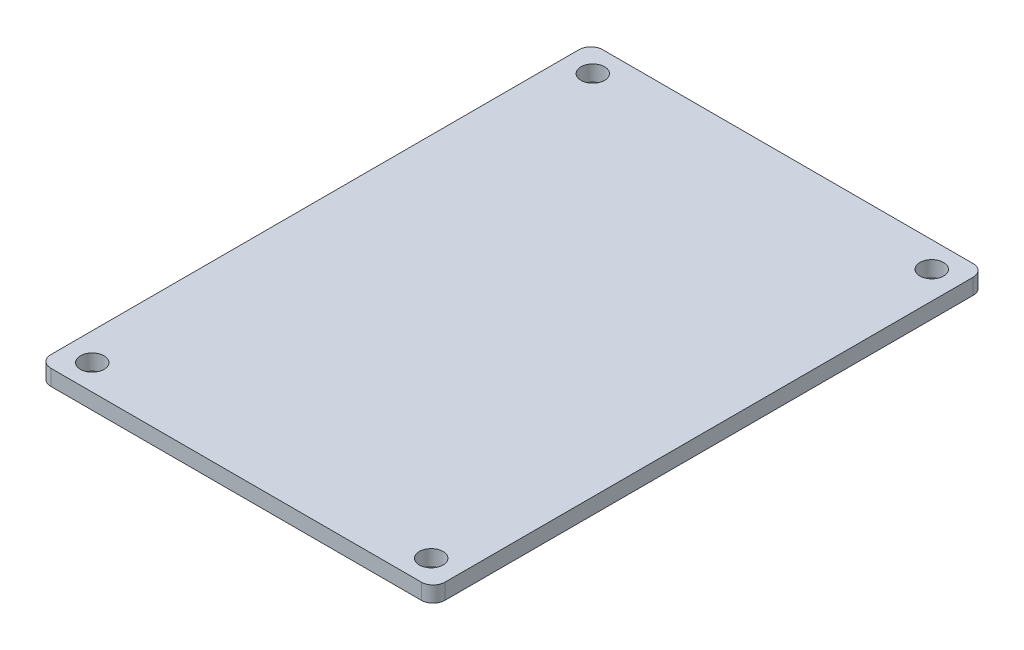
ISO-10303-21;
HEADER;
FILE_DESCRIPTION(('STEP AP214'),'2;1');
FILE_NAME('part.step','',(''),(''),'','','');
FILE_SCHEMA(('AUTOMOTIVE_DESIGN { 1 0 10303 214 1 1 1 1 }'));
ENDSEC;
DATA;
#1=APPLICATION_CONTEXT('core data for automotive mechanical design processes');
#2=APPLICATION_PROTOCOL_DEFINITION('international standard','automotive_design',2000,#1);
#3=PRODUCT_CONTEXT('',#1,'mechanical');
#4=PRODUCT('Part','Part','',(#3));
#5=PRODUCT_RELATED_PRODUCT_CATEGORY('part','',(#4));
#6=PRODUCT_DEFINITION_FORMATION('','',#4);
#7=PRODUCT_DEFINITION_CONTEXT('part definition',#1,'design');
#8=PRODUCT_DEFINITION('design','',#6,#7);
#9=PRODUCT_DEFINITION_SHAPE('','',#8);
#10=(LENGTH_UNIT() NAMED_UNIT(*) SI_UNIT(.MILLI.,.METRE.));
#11=(NAMED_UNIT(*) PLANE_ANGLE_UNIT() SI_UNIT($,.RADIAN.));
#12=(NAMED_UNIT(*) SI_UNIT($,.STERADIAN.) SOLID_ANGLE_UNIT());
#13=UNCERTAINTY_MEASURE_WITH_UNIT(LENGTH_MEASURE(1.E-05),#10,'distance_accuracy_value','');
#14=(GEOMETRIC_REPRESENTATION_CONTEXT(3) GLOBAL_UNCERTAINTY_ASSIGNED_CONTEXT((#13)) GLOBAL_UNIT_ASSIGNED_CONTEXT((#10,
#11,#12)) REPRESENTATION_CONTEXT('',''));
#15=CARTESIAN_POINT('',(0.,0.,0.));
#16=DIRECTION('',(0.,0.,1.));
#17=DIRECTION('',(1.,0.,0.));
#18=AXIS2_PLACEMENT_3D('',#15,#16,#17);
#19=CARTESIAN_POINT('',(-67.2101449275362,4.,-82.8079710144928));
#20=DIRECTION('',(1.,0.,0.));
#21=DIRECTION('',(0.,0.,-1.));
#22=AXIS2_PLACEMENT_3D('',#19,#20,#21);
#23=PLANE('',#22);
#24=DIRECTION('',(0.,0.,1.));
#25=VECTOR('',#24,1.);
#26=CARTESIAN_POINT('',(-67.2101449275362,4.,-82.8079710144928));
#27=LINE('',#26,#25);
#28=CARTESIAN_POINT('',(-67.2101449275362,4.,-79.8079710144928));
#29=VERTEX_POINT('',#28);
#30=CARTESIAN_POINT('',(-67.2101449275362,4.,54.1920289855073));
#31=VERTEX_POINT('',#30);
#32=EDGE_CURVE('E146',#29,#31,#27,.T.);
#33=ORIENTED_EDGE('',*,*,#32,.F.);
#34=DIRECTION('',(0.,-1.,0.));
#35=VECTOR('',#34,1.);
#36=CARTESIAN_POINT('',(-67.2101449275362,4.,-79.8079710144928));
#37=LINE('',#36,#35);
#38=CARTESIAN_POINT('',(-67.2101449275362,0.,-79.8079710144928));
#39=VERTEX_POINT('',#38);
#40=EDGE_CURVE('E11',#29,#39,#37,.T.);
#41=ORIENTED_EDGE('',*,*,#40,.T.);
#42=DIRECTION('',(0.,0.,1.));
#43=VECTOR('',#42,1.);
#44=CARTESIAN_POINT('',(-67.2101449275362,0.,-82.8079710144928));
#45=LINE('',#44,#43);
#46=CARTESIAN_POINT('',(-67.2101449275362,0.,54.1920289855073));
#47=VERTEX_POINT('',#46);
#48=EDGE_CURVE('E148',#39,#47,#45,.T.);
#49=ORIENTED_EDGE('',*,*,#48,.T.);
#50=DIRECTION('',(0.,-1.,0.));
#51=VECTOR('',#50,1.);
#52=CARTESIAN_POINT('',(-67.2101449275362,4.,54.1920289855073));
#53=LINE('',#52,#51);
#54=EDGE_CURVE('E54',#47,#31,#53,.F.);
#55=ORIENTED_EDGE('',*,*,#54,.T.);
#56=EDGE_LOOP('',(#33,#41,#49,#55));
#57=FACE_BOUND('',#56,.T.);
#58=ADVANCED_FACE('F45',(#57),#23,.F.);
#59=CARTESIAN_POINT('',(-67.2101449275362,4.,57.1920289855073));
#60=DIRECTION('',(0.,0.,-1.));
#61=DIRECTION('',(-1.,0.,0.));
#62=AXIS2_PLACEMENT_3D('',#59,#60,#61);
#63=PLANE('',#62);
#64=DIRECTION('',(1.,0.,0.));
#65=VECTOR('',#64,1.);
#66=CARTESIAN_POINT('',(-67.2101449275362,0.,57.1920289855073));
#67=LINE('',#66,#65);
#68=CARTESIAN_POINT('',(-64.2101449275362,0.,57.1920289855073));
#69=VERTEX_POINT('',#68);
#70=CARTESIAN_POINT('',(29.7898550724637,0.,57.1920289855073));
#71=VERTEX_POINT('',#70);
#72=EDGE_CURVE('E142',#69,#71,#67,.T.);
#73=ORIENTED_EDGE('',*,*,#72,.T.);
#74=DIRECTION('',(0.,-1.,0.));
#75=VECTOR('',#74,1.);
#76=CARTESIAN_POINT('',(29.7898550724638,4.,57.1920289855073));
#77=LINE('',#76,#75);
#78=CARTESIAN_POINT('',(29.7898550724637,4.,57.1920289855073));
#79=VERTEX_POINT('',#78);
#80=EDGE_CURVE('E118',#71,#79,#77,.F.);
#81=ORIENTED_EDGE('',*,*,#80,.T.);
#82=DIRECTION('',(1.,0.,0.));
#83=VECTOR('',#82,1.);
#84=CARTESIAN_POINT('',(-67.2101449275362,4.,57.1920289855073));
#85=LINE('',#84,#83);
#86=CARTESIAN_POINT('',(-64.2101449275362,4.,57.1920289855073));
#87=VERTEX_POINT('',#86);
#88=EDGE_CURVE('E198',#87,#79,#85,.T.);
#89=ORIENTED_EDGE('',*,*,#88,.F.);
#90=DIRECTION('',(0.,-1.,0.));
#91=VECTOR('',#90,1.);
#92=CARTESIAN_POINT('',(-64.2101449275362,4.,57.1920289855073));
#93=LINE('',#92,#91);
#94=EDGE_CURVE('E124',#87,#69,#93,.T.);
#95=ORIENTED_EDGE('',*,*,#94,.T.);
#96=EDGE_LOOP('',(#73,#81,#89,#95));
#97=FACE_BOUND('',#96,.T.);
#98=ADVANCED_FACE('F202',(#97),#63,.F.);
#99=CARTESIAN_POINT('',(32.7898550724638,4.,-82.8079710144928));
#100=DIRECTION('',(-1.,0.,0.));
#101=DIRECTION('',(0.,0.,1.));
#102=AXIS2_PLACEMENT_3D('',#99,#100,#101);
#103=PLANE('',#102);
#104=DIRECTION('',(0.,0.,-1.));
#105=VECTOR('',#104,1.);
#106=CARTESIAN_POINT('',(32.7898550724638,4.,-82.8079710144928));
#107=LINE('',#106,#105);
#108=CARTESIAN_POINT('',(32.7898550724638,4.,54.1920289855073));
#109=VERTEX_POINT('',#108);
#110=CARTESIAN_POINT('',(32.7898550724638,4.,-79.8079710144928));
#111=VERTEX_POINT('',#110);
#112=EDGE_CURVE('E133',#109,#111,#107,.T.);
#113=ORIENTED_EDGE('',*,*,#112,.F.);
#114=DIRECTION('',(0.,-1.,0.));
#115=VECTOR('',#114,1.);
#116=CARTESIAN_POINT('',(32.7898550724638,4.,54.1920289855073));
#117=LINE('',#116,#115);
#118=CARTESIAN_POINT('',(32.7898550724638,0.,54.1920289855073));
#119=VERTEX_POINT('',#118);
#120=EDGE_CURVE('E117',#109,#119,#117,.T.);
#121=ORIENTED_EDGE('',*,*,#120,.T.);
#122=DIRECTION('',(0.,0.,-1.));
#123=VECTOR('',#122,1.);
#124=CARTESIAN_POINT('',(32.7898550724638,0.,-82.8079710144928));
#125=LINE('',#124,#123);
#126=CARTESIAN_POINT('',(32.7898550724638,0.,-79.8079710144928));
#127=VERTEX_POINT('',#126);
#128=EDGE_CURVE('E131',#119,#127,#125,.T.);
#129=ORIENTED_EDGE('',*,*,#128,.T.);
#130=DIRECTION('',(0.,-1.,0.));
#131=VECTOR('',#130,1.);
#132=CARTESIAN_POINT('',(32.7898550724638,4.,-79.8079710144928));
#133=LINE('',#132,#131);
#134=EDGE_CURVE('E136',#127,#111,#133,.F.);
#135=ORIENTED_EDGE('',*,*,#134,.T.);
#136=EDGE_LOOP('',(#113,#121,#129,#135));
#137=FACE_BOUND('',#136,.T.);
#138=ADVANCED_FACE('F130',(#137),#103,.F.);
#139=CARTESIAN_POINT('',(-67.2101449275362,4.,-82.8079710144928));
#140=DIRECTION('',(0.,0.,1.));
#141=DIRECTION('',(1.,0.,0.));
#142=AXIS2_PLACEMENT_3D('',#139,#140,#141);
#143=PLANE('',#142);
#144=DIRECTION('',(-1.,0.,0.));
#145=VECTOR('',#144,1.);
#146=CARTESIAN_POINT('',(-67.2101449275362,4.,-82.8079710144928));
#147=LINE('',#146,#145);
#148=CARTESIAN_POINT('',(29.7898550724637,4.,-82.8079710144928));
#149=VERTEX_POINT('',#148);
#150=CARTESIAN_POINT('',(-64.2101449275362,4.,-82.8079710144928));
#151=VERTEX_POINT('',#150);
#152=EDGE_CURVE('E153',#149,#151,#147,.T.);
#153=ORIENTED_EDGE('',*,*,#152,.F.);
#154=DIRECTION('',(0.,-1.,0.));
#155=VECTOR('',#154,1.);
#156=CARTESIAN_POINT('',(29.7898550724637,4.,-82.8079710144928));
#157=LINE('',#156,#155);
#158=CARTESIAN_POINT('',(29.7898550724637,0.,-82.8079710144928));
#159=VERTEX_POINT('',#158);
#160=EDGE_CURVE('E180',#149,#159,#157,.T.);
#161=ORIENTED_EDGE('',*,*,#160,.T.);
#162=DIRECTION('',(-1.,0.,0.));
#163=VECTOR('',#162,1.);
#164=CARTESIAN_POINT('',(-67.2101449275362,0.,-82.8079710144928));
#165=LINE('',#164,#163);
#166=CARTESIAN_POINT('',(-64.2101449275362,0.,-82.8079710144928));
#167=VERTEX_POINT('',#166);
#168=EDGE_CURVE('E141',#159,#167,#165,.T.);
#169=ORIENTED_EDGE('',*,*,#168,.T.);
#170=DIRECTION('',(0.,-1.,0.));
#171=VECTOR('',#170,1.);
#172=CARTESIAN_POINT('',(-64.2101449275362,4.,-82.8079710144928));
#173=LINE('',#172,#171);
#174=EDGE_CURVE('E61',#167,#151,#173,.F.);
#175=ORIENTED_EDGE('',*,*,#174,.T.);
#176=EDGE_LOOP('',(#153,#161,#169,#175));
#177=FACE_BOUND('',#176,.T.);
#178=ADVANCED_FACE('F248',(#177),#143,.F.);
#179=CARTESIAN_POINT('',(0.,4.,0.));
#180=DIRECTION('',(0.,1.,0.));
#181=DIRECTION('',(0.,0.,1.));
#182=AXIS2_PLACEMENT_3D('',#179,#180,#181);
#183=PLANE('',#182);
#184=CARTESIAN_POINT('',(-60.2101449275362,4.,50.6920289855073));
#185=DIRECTION('',(0.,1.,0.));
#186=DIRECTION('',(0.,0.,1.));
#187=AXIS2_PLACEMENT_3D('',#184,#185,#186);
#188=CIRCLE('',#187,3.);
#189=CARTESIAN_POINT('',(-60.2101449275362,4.,53.6920289855073));
#190=VERTEX_POINT('',#189);
#191=EDGE_CURVE('E218',#190,#190,#188,.T.);
#192=ORIENTED_EDGE('',*,*,#191,.F.);
#193=EDGE_LOOP('',(#192));
#194=FACE_BOUND('',#193,.T.);
#195=CARTESIAN_POINT('',(25.7898550724638,4.,-76.3079710144927));
#196=DIRECTION('',(0.,1.,0.));
#197=DIRECTION('',(0.,0.,1.));
#198=AXIS2_PLACEMENT_3D('',#195,#196,#197);
#199=CIRCLE('',#198,3.);
#200=CARTESIAN_POINT('',(25.7898550724638,4.,-73.3079710144927));
#201=VERTEX_POINT('',#200);
#202=EDGE_CURVE('E224',#201,#201,#199,.T.);
#203=ORIENTED_EDGE('',*,*,#202,.F.);
#204=EDGE_LOOP('',(#203));
#205=FACE_BOUND('',#204,.T.);
#206=CARTESIAN_POINT('',(-60.2101449275362,4.,-76.3079710144927));
#207=DIRECTION('',(0.,1.,0.));
#208=DIRECTION('',(0.,0.,1.));
#209=AXIS2_PLACEMENT_3D('',#206,#207,#208);
#210=CIRCLE('',#209,3.);
#211=CARTESIAN_POINT('',(-60.2101449275362,4.,-73.3079710144927));
#212=VERTEX_POINT('',#211);
#213=EDGE_CURVE('E225',#212,#212,#210,.T.);
#214=ORIENTED_EDGE('',*,*,#213,.F.);
#215=EDGE_LOOP('',(#214));
#216=FACE_BOUND('',#215,.T.);
#217=CARTESIAN_POINT('',(25.7898550724638,4.,50.6920289855073));
#218=DIRECTION('',(0.,1.,0.));
#219=DIRECTION('',(0.,0.,1.));
#220=AXIS2_PLACEMENT_3D('',#217,#218,#219);
#221=CIRCLE('',#220,3.);
#222=CARTESIAN_POINT('',(25.7898550724638,4.,53.6920289855073));
#223=VERTEX_POINT('',#222);
#224=EDGE_CURVE('E207',#223,#223,#221,.T.);
#225=ORIENTED_EDGE('',*,*,#224,.F.);
#226=EDGE_LOOP('',(#225));
#227=FACE_BOUND('',#226,.T.);
#228=ORIENTED_EDGE('',*,*,#88,.T.);
#229=CARTESIAN_POINT('',(29.7898550724638,4.,54.1920289855073));
#230=DIRECTION('',(0.,1.,0.));
#231=DIRECTION('',(0.,0.,1.));
#232=AXIS2_PLACEMENT_3D('',#229,#230,#231);
#233=CIRCLE('',#232,3.);
#234=EDGE_CURVE('E175',#79,#109,#233,.T.);
#235=ORIENTED_EDGE('',*,*,#234,.T.);
#236=ORIENTED_EDGE('',*,*,#112,.T.);
#237=CARTESIAN_POINT('',(29.7898550724637,4.,-79.8079710144928));
#238=DIRECTION('',(0.,1.,0.));
#239=DIRECTION('',(0.,0.,1.));
#240=AXIS2_PLACEMENT_3D('',#237,#238,#239);
#241=CIRCLE('',#240,3.);
#242=EDGE_CURVE('E68',#111,#149,#241,.T.);
#243=ORIENTED_EDGE('',*,*,#242,.T.);
#244=ORIENTED_EDGE('',*,*,#152,.T.);
#245=CARTESIAN_POINT('',(-64.2101449275362,4.,-79.8079710144928));
#246=DIRECTION('',(0.,1.,0.));
#247=DIRECTION('',(0.,0.,1.));
#248=AXIS2_PLACEMENT_3D('',#245,#246,#247);
#249=CIRCLE('',#248,3.);
#250=EDGE_CURVE('E170',#151,#29,#249,.T.);
#251=ORIENTED_EDGE('',*,*,#250,.T.);
#252=ORIENTED_EDGE('',*,*,#32,.T.);
#253=CARTESIAN_POINT('',(-64.2101449275362,4.,54.1920289855073));
#254=DIRECTION('',(0.,1.,0.));
#255=DIRECTION('',(0.,0.,1.));
#256=AXIS2_PLACEMENT_3D('',#253,#254,#255);
#257=CIRCLE('',#256,3.);
#258=EDGE_CURVE('E167',#31,#87,#257,.T.);
#259=ORIENTED_EDGE('',*,*,#258,.T.);
#260=EDGE_LOOP('',(#228,#235,#236,#243,#244,#251,#252,#259));
#261=FACE_BOUND('',#260,.T.);
#262=ADVANCED_FACE('F194',(#194,#205,#216,#227,#261),#183,.T.);
#263=CARTESIAN_POINT('',(0.,0.,0.));
#264=DIRECTION('',(0.,1.,0.));
#265=DIRECTION('',(0.,0.,1.));
#266=AXIS2_PLACEMENT_3D('',#263,#264,#265);
#267=PLANE('',#266);
#268=CARTESIAN_POINT('',(-60.2101449275362,0.,50.6920289855073));
#269=DIRECTION('',(0.,1.,0.));
#270=DIRECTION('',(0.,0.,1.));
#271=AXIS2_PLACEMENT_3D('',#268,#269,#270);
#272=CIRCLE('',#271,3.);
#273=CARTESIAN_POINT('',(-60.2101449275362,0.,53.6920289855073));
#274=VERTEX_POINT('',#273);
#275=EDGE_CURVE('E229',#274,#274,#272,.T.);
#276=ORIENTED_EDGE('',*,*,#275,.T.);
#277=EDGE_LOOP('',(#276));
#278=FACE_BOUND('',#277,.T.);
#279=CARTESIAN_POINT('',(25.7898550724638,0.,-76.3079710144927));
#280=DIRECTION('',(0.,1.,0.));
#281=DIRECTION('',(0.,0.,1.));
#282=AXIS2_PLACEMENT_3D('',#279,#280,#281);
#283=CIRCLE('',#282,3.);
#284=CARTESIAN_POINT('',(25.7898550724638,0.,-73.3079710144927));
#285=VERTEX_POINT('',#284);
#286=EDGE_CURVE('E220',#285,#285,#283,.T.);
#287=ORIENTED_EDGE('',*,*,#286,.T.);
#288=EDGE_LOOP('',(#287));
#289=FACE_BOUND('',#288,.T.);
#290=CARTESIAN_POINT('',(-60.2101449275362,0.,-76.3079710144927));
#291=DIRECTION('',(0.,1.,0.));
#292=DIRECTION('',(0.,0.,1.));
#293=AXIS2_PLACEMENT_3D('',#290,#291,#292);
#294=CIRCLE('',#293,3.);
#295=CARTESIAN_POINT('',(-60.2101449275362,0.,-73.3079710144927));
#296=VERTEX_POINT('',#295);
#297=EDGE_CURVE('E236',#296,#296,#294,.T.);
#298=ORIENTED_EDGE('',*,*,#297,.T.);
#299=EDGE_LOOP('',(#298));
#300=FACE_BOUND('',#299,.T.);
#301=CARTESIAN_POINT('',(25.7898550724638,0.,50.6920289855073));
#302=DIRECTION('',(0.,1.,0.));
#303=DIRECTION('',(0.,0.,1.));
#304=AXIS2_PLACEMENT_3D('',#301,#302,#303);
#305=CIRCLE('',#304,3.);
#306=CARTESIAN_POINT('',(25.7898550724638,0.,53.6920289855073));
#307=VERTEX_POINT('',#306);
#308=EDGE_CURVE('E204',#307,#307,#305,.T.);
#309=ORIENTED_EDGE('',*,*,#308,.T.);
#310=EDGE_LOOP('',(#309));
#311=FACE_BOUND('',#310,.T.);
#312=ORIENTED_EDGE('',*,*,#128,.F.);
#313=CARTESIAN_POINT('',(29.7898550724638,0.,54.1920289855073));
#314=DIRECTION('',(0.,1.,0.));
#315=DIRECTION('',(0.,0.,1.));
#316=AXIS2_PLACEMENT_3D('',#313,#314,#315);
#317=CIRCLE('',#316,3.);
#318=EDGE_CURVE('E113',#119,#71,#317,.F.);
#319=ORIENTED_EDGE('',*,*,#318,.T.);
#320=ORIENTED_EDGE('',*,*,#72,.F.);
#321=CARTESIAN_POINT('',(-64.2101449275362,0.,54.1920289855073));
#322=DIRECTION('',(0.,1.,0.));
#323=DIRECTION('',(0.,0.,1.));
#324=AXIS2_PLACEMENT_3D('',#321,#322,#323);
#325=CIRCLE('',#324,3.);
#326=EDGE_CURVE('E135',#69,#47,#325,.F.);
#327=ORIENTED_EDGE('',*,*,#326,.T.);
#328=ORIENTED_EDGE('',*,*,#48,.F.);
#329=CARTESIAN_POINT('',(-64.2101449275362,0.,-79.8079710144928));
#330=DIRECTION('',(0.,1.,0.));
#331=DIRECTION('',(0.,0.,1.));
#332=AXIS2_PLACEMENT_3D('',#329,#330,#331);
#333=CIRCLE('',#332,3.);
#334=EDGE_CURVE('E157',#39,#167,#333,.F.);
#335=ORIENTED_EDGE('',*,*,#334,.T.);
#336=ORIENTED_EDGE('',*,*,#168,.F.);
#337=CARTESIAN_POINT('',(29.7898550724637,0.,-79.8079710144928));
#338=DIRECTION('',(0.,1.,0.));
#339=DIRECTION('',(0.,0.,1.));
#340=AXIS2_PLACEMENT_3D('',#337,#338,#339);
#341=CIRCLE('',#340,3.);
#342=EDGE_CURVE('E125',#159,#127,#341,.F.);
#343=ORIENTED_EDGE('',*,*,#342,.T.);
#344=EDGE_LOOP('',(#312,#319,#320,#327,#328,#335,#336,#343));
#345=FACE_BOUND('',#344,.T.);
#346=ADVANCED_FACE('F138',(#278,#289,#300,#311,#345),#267,.F.);
#347=CARTESIAN_POINT('',(25.7898550724638,0.,50.6920289855073));
#348=DIRECTION('',(0.,1.,0.));
#349=DIRECTION('',(0.,0.,1.));
#350=AXIS2_PLACEMENT_3D('',#347,#348,#349);
#351=CYLINDRICAL_SURFACE('',#350,3.);
#352=ORIENTED_EDGE('',*,*,#308,.F.);
#353=EDGE_LOOP('',(#352));
#354=FACE_BOUND('',#353,.T.);
#355=ORIENTED_EDGE('',*,*,#224,.T.);
#356=EDGE_LOOP('',(#355));
#357=FACE_BOUND('',#356,.T.);
#358=ADVANCED_FACE('F253',(#354,#357),#351,.F.);
#359=CARTESIAN_POINT('',(-60.2101449275362,0.,-76.3079710144927));
#360=DIRECTION('',(0.,1.,0.));
#361=DIRECTION('',(0.,0.,1.));
#362=AXIS2_PLACEMENT_3D('',#359,#360,#361);
#363=CYLINDRICAL_SURFACE('',#362,3.);
#364=ORIENTED_EDGE('',*,*,#297,.F.);
#365=EDGE_LOOP('',(#364));
#366=FACE_BOUND('',#365,.T.);
#367=ORIENTED_EDGE('',*,*,#213,.T.);
#368=EDGE_LOOP('',(#367));
#369=FACE_BOUND('',#368,.T.);
#370=ADVANCED_FACE('F244',(#366,#369),#363,.F.);
#371=CARTESIAN_POINT('',(25.7898550724638,0.,-76.3079710144927));
#372=DIRECTION('',(0.,1.,0.));
#373=DIRECTION('',(0.,0.,1.));
#374=AXIS2_PLACEMENT_3D('',#371,#372,#373);
#375=CYLINDRICAL_SURFACE('',#374,3.);
#376=ORIENTED_EDGE('',*,*,#286,.F.);
#377=EDGE_LOOP('',(#376));
#378=FACE_BOUND('',#377,.T.);
#379=ORIENTED_EDGE('',*,*,#202,.T.);
#380=EDGE_LOOP('',(#379));
#381=FACE_BOUND('',#380,.T.);
#382=ADVANCED_FACE('F261',(#378,#381),#375,.F.);
#383=CARTESIAN_POINT('',(-60.2101449275362,0.,50.6920289855073));
#384=DIRECTION('',(0.,1.,0.));
#385=DIRECTION('',(0.,0.,1.));
#386=AXIS2_PLACEMENT_3D('',#383,#384,#385);
#387=CYLINDRICAL_SURFACE('',#386,3.);
#388=ORIENTED_EDGE('',*,*,#275,.F.);
#389=EDGE_LOOP('',(#388));
#390=FACE_BOUND('',#389,.T.);
#391=ORIENTED_EDGE('',*,*,#191,.T.);
#392=EDGE_LOOP('',(#391));
#393=FACE_BOUND('',#392,.T.);
#394=ADVANCED_FACE('F279',(#390,#393),#387,.F.);
#395=CARTESIAN_POINT('',(29.7898550724638,4.,54.1920289855073));
#396=DIRECTION('',(0.,-1.,0.));
#397=DIRECTION('',(0.,0.,-1.));
#398=AXIS2_PLACEMENT_3D('',#395,#396,#397);
#399=CYLINDRICAL_SURFACE('',#398,3.);
#400=ORIENTED_EDGE('',*,*,#234,.F.);
#401=ORIENTED_EDGE('',*,*,#80,.F.);
#402=ORIENTED_EDGE('',*,*,#318,.F.);
#403=ORIENTED_EDGE('',*,*,#120,.F.);
#404=EDGE_LOOP('',(#400,#401,#402,#403));
#405=FACE_BOUND('',#404,.T.);
#406=ADVANCED_FACE('F116',(#405),#399,.T.);
#407=CARTESIAN_POINT('',(29.7898550724637,4.,-79.8079710144928));
#408=DIRECTION('',(0.,-1.,0.));
#409=DIRECTION('',(0.,0.,-1.));
#410=AXIS2_PLACEMENT_3D('',#407,#408,#409);
#411=CYLINDRICAL_SURFACE('',#410,3.);
#412=ORIENTED_EDGE('',*,*,#242,.F.);
#413=ORIENTED_EDGE('',*,*,#134,.F.);
#414=ORIENTED_EDGE('',*,*,#342,.F.);
#415=ORIENTED_EDGE('',*,*,#160,.F.);
#416=EDGE_LOOP('',(#412,#413,#414,#415));
#417=FACE_BOUND('',#416,.T.);
#418=ADVANCED_FACE('F278',(#417),#411,.T.);
#419=CARTESIAN_POINT('',(-64.2101449275362,4.,-79.8079710144928));
#420=DIRECTION('',(0.,-1.,0.));
#421=DIRECTION('',(0.,0.,-1.));
#422=AXIS2_PLACEMENT_3D('',#419,#420,#421);
#423=CYLINDRICAL_SURFACE('',#422,3.);
#424=ORIENTED_EDGE('',*,*,#250,.F.);
#425=ORIENTED_EDGE('',*,*,#174,.F.);
#426=ORIENTED_EDGE('',*,*,#334,.F.);
#427=ORIENTED_EDGE('',*,*,#40,.F.);
#428=EDGE_LOOP('',(#424,#425,#426,#427));
#429=FACE_BOUND('',#428,.T.);
#430=ADVANCED_FACE('F281',(#429),#423,.T.);
#431=CARTESIAN_POINT('',(-64.2101449275362,4.,54.1920289855073));
#432=DIRECTION('',(0.,-1.,0.));
#433=DIRECTION('',(0.,0.,-1.));
#434=AXIS2_PLACEMENT_3D('',#431,#432,#433);
#435=CYLINDRICAL_SURFACE('',#434,3.);
#436=ORIENTED_EDGE('',*,*,#258,.F.);
#437=ORIENTED_EDGE('',*,*,#54,.F.);
#438=ORIENTED_EDGE('',*,*,#326,.F.);
#439=ORIENTED_EDGE('',*,*,#94,.F.);
#440=EDGE_LOOP('',(#436,#437,#438,#439));
#441=FACE_BOUND('',#440,.T.);
#442=ADVANCED_FACE('F47',(#441),#435,.T.);
#443=CLOSED_SHELL('',(#58,#98,#138,#178,#262,#346,#358,#370,#382,#394,#406,#418,#430,#442));
#444=MANIFOLD_SOLID_BREP('B2',#443);
#445=ADVANCED_BREP_SHAPE_REPRESENTATION('',(#18,#444),#14);
#446=SHAPE_DEFINITION_REPRESENTATION(#9,#445);
ENDSEC;
END-ISO-10303-21;
